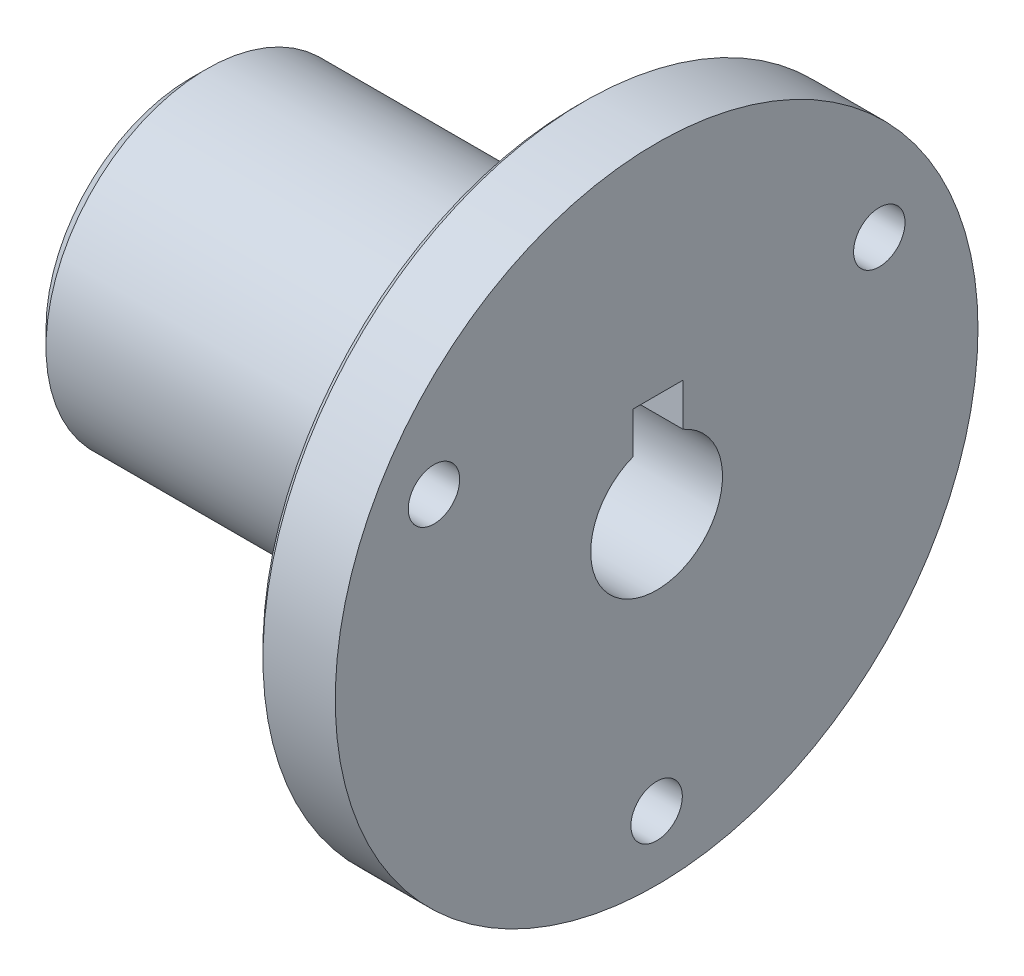
ISO-10303-21;
HEADER;
FILE_DESCRIPTION(('STEP AP214'),'2;1');
FILE_NAME('part.step','',(''),(''),'','','');
FILE_SCHEMA(('AUTOMOTIVE_DESIGN { 1 0 10303 214 1 1 1 1 }'));
ENDSEC;
DATA;
#1=APPLICATION_CONTEXT('core data for automotive mechanical design processes');
#2=APPLICATION_PROTOCOL_DEFINITION('international standard','automotive_design',2000,#1);
#3=PRODUCT_CONTEXT('',#1,'mechanical');
#4=PRODUCT('Part','Part','',(#3));
#5=PRODUCT_RELATED_PRODUCT_CATEGORY('part','',(#4));
#6=PRODUCT_DEFINITION_FORMATION('','',#4);
#7=PRODUCT_DEFINITION_CONTEXT('part definition',#1,'design');
#8=PRODUCT_DEFINITION('design','',#6,#7);
#9=PRODUCT_DEFINITION_SHAPE('','',#8);
#10=(LENGTH_UNIT() NAMED_UNIT(*) SI_UNIT(.MILLI.,.METRE.));
#11=(NAMED_UNIT(*) PLANE_ANGLE_UNIT() SI_UNIT($,.RADIAN.));
#12=(NAMED_UNIT(*) SI_UNIT($,.STERADIAN.) SOLID_ANGLE_UNIT());
#13=UNCERTAINTY_MEASURE_WITH_UNIT(LENGTH_MEASURE(1.E-05),#10,'distance_accuracy_value','');
#14=(GEOMETRIC_REPRESENTATION_CONTEXT(3) GLOBAL_UNCERTAINTY_ASSIGNED_CONTEXT((#13)) GLOBAL_UNIT_ASSIGNED_CONTEXT((#10,
#11,#12)) REPRESENTATION_CONTEXT('',''));
#15=CARTESIAN_POINT('',(0.,0.,0.));
#16=DIRECTION('',(0.,0.,1.));
#17=DIRECTION('',(1.,0.,0.));
#18=AXIS2_PLACEMENT_3D('',#15,#16,#17);
#19=CARTESIAN_POINT('',(0.,0.,0.));
#20=DIRECTION('',(1.,0.,0.));
#21=DIRECTION('',(0.,0.,-1.));
#22=AXIS2_PLACEMENT_3D('',#19,#20,#21);
#23=PLANE('',#22);
#24=CARTESIAN_POINT('',(0.,0.,0.));
#25=DIRECTION('',(1.,0.,0.));
#26=DIRECTION('',(0.,0.,-1.));
#27=AXIS2_PLACEMENT_3D('',#24,#25,#26);
#28=CIRCLE('',#27,9.);
#29=CARTESIAN_POINT('',(0.,0.,-9.));
#30=VERTEX_POINT('',#29);
#31=EDGE_CURVE('E304',#30,#30,#28,.F.);
#32=ORIENTED_EDGE('',*,*,#31,.T.);
#33=EDGE_LOOP('',(#32));
#34=FACE_BOUND('',#33,.T.);
#35=DIRECTION('',(0.,-1.,0.));
#36=VECTOR('',#35,1.);
#37=CARTESIAN_POINT('',(0.,6.00881172752133,1.46));
#38=LINE('',#37,#36);
#39=CARTESIAN_POINT('',(0.,6.4,1.46));
#40=VERTEX_POINT('',#39);
#41=CARTESIAN_POINT('',(0.,4.36215543051827,1.46));
#42=VERTEX_POINT('',#41);
#43=EDGE_CURVE('E142',#40,#42,#38,.T.);
#44=ORIENTED_EDGE('',*,*,#43,.T.);
#45=CARTESIAN_POINT('',(0.,0.,0.));
#46=DIRECTION('',(1.,0.,0.));
#47=DIRECTION('',(0.,0.,-1.));
#48=AXIS2_PLACEMENT_3D('',#45,#46,#47);
#49=CIRCLE('',#48,4.6);
#50=CARTESIAN_POINT('',(0.,4.29772032594025,-1.64));
#51=VERTEX_POINT('',#50);
#52=EDGE_CURVE('E95',#42,#51,#49,.T.);
#53=ORIENTED_EDGE('',*,*,#52,.T.);
#54=DIRECTION('',(0.,1.,0.));
#55=VECTOR('',#54,1.);
#56=CARTESIAN_POINT('',(0.,6.4,-1.64));
#57=LINE('',#56,#55);
#58=CARTESIAN_POINT('',(0.,6.4,-1.64));
#59=VERTEX_POINT('',#58);
#60=EDGE_CURVE('E137',#51,#59,#57,.T.);
#61=ORIENTED_EDGE('',*,*,#60,.T.);
#62=DIRECTION('',(0.,0.,1.));
#63=VECTOR('',#62,1.);
#64=CARTESIAN_POINT('',(0.,6.4,1.46));
#65=LINE('',#64,#63);
#66=EDGE_CURVE('E139',#59,#40,#65,.T.);
#67=ORIENTED_EDGE('',*,*,#66,.T.);
#68=EDGE_LOOP('',(#44,#53,#61,#67));
#69=FACE_BOUND('',#68,.T.);
#70=ADVANCED_FACE('F41',(#34,#69),#23,.F.);
#71=CARTESIAN_POINT('',(24.,0.,0.));
#72=DIRECTION('',(-1.,0.,0.));
#73=DIRECTION('',(0.,0.,1.));
#74=AXIS2_PLACEMENT_3D('',#71,#72,#73);
#75=CYLINDRICAL_SURFACE('',#74,10.);
#76=CARTESIAN_POINT('',(22.,0.,0.));
#77=DIRECTION('',(1.,0.,0.));
#78=DIRECTION('',(0.,0.,-1.));
#79=AXIS2_PLACEMENT_3D('',#76,#77,#78);
#80=CIRCLE('',#79,10.);
#81=CARTESIAN_POINT('',(22.,0.,-10.));
#82=VERTEX_POINT('',#81);
#83=EDGE_CURVE('E11',#82,#82,#80,.F.);
#84=ORIENTED_EDGE('',*,*,#83,.T.);
#85=EDGE_LOOP('',(#84));
#86=FACE_BOUND('',#85,.T.);
#87=CARTESIAN_POINT('',(0.999999999999994,0.,0.));
#88=DIRECTION('',(1.,0.,0.));
#89=DIRECTION('',(0.,0.,-1.));
#90=AXIS2_PLACEMENT_3D('',#87,#88,#89);
#91=CIRCLE('',#90,10.);
#92=CARTESIAN_POINT('',(0.999999999999994,0.,-10.));
#93=VERTEX_POINT('',#92);
#94=EDGE_CURVE('E186',#93,#93,#91,.T.);
#95=ORIENTED_EDGE('',*,*,#94,.T.);
#96=EDGE_LOOP('',(#95));
#97=FACE_BOUND('',#96,.T.);
#98=ADVANCED_FACE('F176',(#86,#97),#75,.T.);
#99=CARTESIAN_POINT('',(24.,0.,0.));
#100=DIRECTION('',(-1.,0.,0.));
#101=DIRECTION('',(0.,0.,1.));
#102=AXIS2_PLACEMENT_3D('',#99,#100,#101);
#103=CYLINDRICAL_SURFACE('',#102,4.1);
#104=DIRECTION('',(-1.,0.,0.));
#105=VECTOR('',#104,1.);
#106=CARTESIAN_POINT('',(24.,3.75771206986379,-1.64));
#107=LINE('',#106,#105);
#108=CARTESIAN_POINT('',(29.,3.75771206986379,-1.64));
#109=VERTEX_POINT('',#108);
#110=CARTESIAN_POINT('',(0.5,3.75771206986379,-1.64));
#111=VERTEX_POINT('',#110);
#112=EDGE_CURVE('E96',#109,#111,#107,.T.);
#113=ORIENTED_EDGE('',*,*,#112,.T.);
#114=CARTESIAN_POINT('',(0.5,0.,0.));
#115=DIRECTION('',(1.,0.,0.));
#116=DIRECTION('',(0.,0.,-1.));
#117=AXIS2_PLACEMENT_3D('',#114,#115,#116);
#118=CIRCLE('',#117,4.1);
#119=CARTESIAN_POINT('',(0.5,3.83124000814358,1.46));
#120=VERTEX_POINT('',#119);
#121=EDGE_CURVE('E57',#111,#120,#118,.F.);
#122=ORIENTED_EDGE('',*,*,#121,.T.);
#123=DIRECTION('',(-1.,0.,0.));
#124=VECTOR('',#123,1.);
#125=CARTESIAN_POINT('',(24.,3.83124000814358,1.46));
#126=LINE('',#125,#124);
#127=CARTESIAN_POINT('',(29.,3.83124000814358,1.46));
#128=VERTEX_POINT('',#127);
#129=EDGE_CURVE('E87',#128,#120,#126,.T.);
#130=ORIENTED_EDGE('',*,*,#129,.F.);
#131=CARTESIAN_POINT('',(29.,0.,0.));
#132=DIRECTION('',(1.,0.,0.));
#133=DIRECTION('',(0.,0.,-1.));
#134=AXIS2_PLACEMENT_3D('',#131,#132,#133);
#135=CIRCLE('',#134,4.1);
#136=EDGE_CURVE('E91',#128,#109,#135,.T.);
#137=ORIENTED_EDGE('',*,*,#136,.T.);
#138=EDGE_LOOP('',(#113,#122,#130,#137));
#139=FACE_BOUND('',#138,.T.);
#140=ADVANCED_FACE('F89',(#139),#103,.F.);
#141=CARTESIAN_POINT('',(24.,6.4,-1.64));
#142=DIRECTION('',(0.,0.,1.));
#143=DIRECTION('',(1.,0.,0.));
#144=AXIS2_PLACEMENT_3D('',#141,#142,#143);
#145=PLANE('',#144);
#146=ORIENTED_EDGE('',*,*,#60,.F.);
#147=CARTESIAN_POINT('',(0.,4.29772032594025,-1.64));
#148=CARTESIAN_POINT('',(0.083734465461264,4.20809163948556,-1.64));
#149=CARTESIAN_POINT('',(0.167296383439877,4.11830132067219,-1.64));
#150=CARTESIAN_POINT('',(0.292317271278129,3.98331792791384,-1.64));
#151=CARTESIAN_POINT('',(0.33393720792005,3.93827384152286,-1.64));
#152=CARTESIAN_POINT('',(0.417059488420711,3.84807683291622,-1.64));
#153=CARTESIAN_POINT('',(0.458561831608511,3.80292391008229,-1.64));
#154=CARTESIAN_POINT('',(0.5,3.75771206986379,-1.64));
#155=B_SPLINE_CURVE_WITH_KNOTS('',3,(#147,#148,#149,#150,#151,#152,#153,#154),.UNSPECIFIED.,.F.,
.F.,(4,2,2,4),(0.,0.36797134451166,0.551956770182269,0.735943243493419),.UNSPECIFIED.);
#156=EDGE_CURVE('E65',#51,#111,#155,.T.);
#157=ORIENTED_EDGE('',*,*,#156,.T.);
#158=ORIENTED_EDGE('',*,*,#112,.F.);
#159=DIRECTION('',(0.,1.,0.));
#160=VECTOR('',#159,1.);
#161=CARTESIAN_POINT('',(29.,6.4,-1.64));
#162=LINE('',#161,#160);
#163=CARTESIAN_POINT('',(29.,6.4,-1.64));
#164=VERTEX_POINT('',#163);
#165=EDGE_CURVE('E111',#109,#164,#162,.T.);
#166=ORIENTED_EDGE('',*,*,#165,.T.);
#167=DIRECTION('',(-1.,0.,0.));
#168=VECTOR('',#167,1.);
#169=CARTESIAN_POINT('',(24.,6.4,-1.64));
#170=LINE('',#169,#168);
#171=EDGE_CURVE('E146',#164,#59,#170,.T.);
#172=ORIENTED_EDGE('',*,*,#171,.T.);
#173=EDGE_LOOP('',(#146,#157,#158,#166,#172));
#174=FACE_BOUND('',#173,.T.);
#175=ADVANCED_FACE('F160',(#174),#145,.T.);
#176=CARTESIAN_POINT('',(24.,6.4,1.46));
#177=DIRECTION('',(0.,-1.,0.));
#178=DIRECTION('',(0.,0.,-1.));
#179=AXIS2_PLACEMENT_3D('',#176,#177,#178);
#180=PLANE('',#179);
#181=ORIENTED_EDGE('',*,*,#66,.F.);
#182=ORIENTED_EDGE('',*,*,#171,.F.);
#183=DIRECTION('',(0.,0.,1.));
#184=VECTOR('',#183,1.);
#185=CARTESIAN_POINT('',(29.,6.4,1.46));
#186=LINE('',#185,#184);
#187=CARTESIAN_POINT('',(29.,6.4,1.46));
#188=VERTEX_POINT('',#187);
#189=EDGE_CURVE('E106',#164,#188,#186,.T.);
#190=ORIENTED_EDGE('',*,*,#189,.T.);
#191=DIRECTION('',(-1.,0.,0.));
#192=VECTOR('',#191,1.);
#193=CARTESIAN_POINT('',(24.,6.4,1.46));
#194=LINE('',#193,#192);
#195=EDGE_CURVE('E102',#188,#40,#194,.T.);
#196=ORIENTED_EDGE('',*,*,#195,.T.);
#197=EDGE_LOOP('',(#181,#182,#190,#196));
#198=FACE_BOUND('',#197,.T.);
#199=ADVANCED_FACE('F192',(#198),#180,.T.);
#200=CARTESIAN_POINT('',(24.,6.00881172752133,1.46));
#201=DIRECTION('',(0.,0.,-1.));
#202=DIRECTION('',(-1.,0.,0.));
#203=AXIS2_PLACEMENT_3D('',#200,#201,#202);
#204=PLANE('',#203);
#205=ORIENTED_EDGE('',*,*,#129,.T.);
#206=CARTESIAN_POINT('',(0.5,3.83124000814358,1.46));
#207=CARTESIAN_POINT('',(0.416990224540825,3.92003066092522,1.46));
#208=CARTESIAN_POINT('',(0.33381866210649,4.00866894765339,1.46));
#209=CARTESIAN_POINT('',(0.167151995315462,4.18564075499451,1.46));
#210=CARTESIAN_POINT('',(0.0836568910831308,4.27397427572456,1.46));
#211=CARTESIAN_POINT('',(0.,4.36215543051827,1.46));
#212=B_SPLINE_CURVE_WITH_KNOTS('',3,(#206,#207,#208,#209,#210,#211),.UNSPECIFIED.,.F.,.F.,(4,2,
4),(0.,0.364648175707579,0.729296211267927),.UNSPECIFIED.);
#213=EDGE_CURVE('E179',#120,#42,#212,.T.);
#214=ORIENTED_EDGE('',*,*,#213,.T.);
#215=ORIENTED_EDGE('',*,*,#43,.F.);
#216=ORIENTED_EDGE('',*,*,#195,.F.);
#217=DIRECTION('',(0.,-1.,0.));
#218=VECTOR('',#217,1.);
#219=CARTESIAN_POINT('',(29.,6.4,1.46));
#220=LINE('',#219,#218);
#221=EDGE_CURVE('E99',#188,#128,#220,.T.);
#222=ORIENTED_EDGE('',*,*,#221,.T.);
#223=EDGE_LOOP('',(#205,#214,#215,#216,#222));
#224=FACE_BOUND('',#223,.T.);
#225=ADVANCED_FACE('F100',(#224),#204,.T.);
#226=CARTESIAN_POINT('',(24.,0.,0.));
#227=DIRECTION('',(1.,0.,0.));
#228=DIRECTION('',(0.,0.,-1.));
#229=AXIS2_PLACEMENT_3D('',#226,#227,#228);
#230=PLANE('',#229);
#231=CARTESIAN_POINT('',(24.,0.,0.));
#232=DIRECTION('',(1.,0.,0.));
#233=DIRECTION('',(0.,0.,-1.));
#234=AXIS2_PLACEMENT_3D('',#231,#232,#233);
#235=CIRCLE('',#234,12.);
#236=CARTESIAN_POINT('',(24.,0.,-12.));
#237=VERTEX_POINT('',#236);
#238=EDGE_CURVE('E50',#237,#237,#235,.T.);
#239=ORIENTED_EDGE('',*,*,#238,.T.);
#240=EDGE_LOOP('',(#239));
#241=FACE_BOUND('',#240,.T.);
#242=CARTESIAN_POINT('',(24.,0.,0.));
#243=DIRECTION('',(1.,0.,0.));
#244=DIRECTION('',(0.,0.,-1.));
#245=AXIS2_PLACEMENT_3D('',#242,#243,#244);
#246=CIRCLE('',#245,19.5);
#247=CARTESIAN_POINT('',(24.,0.,-19.5));
#248=VERTEX_POINT('',#247);
#249=EDGE_CURVE('E298',#248,#248,#246,.F.);
#250=ORIENTED_EDGE('',*,*,#249,.T.);
#251=EDGE_LOOP('',(#250));
#252=FACE_BOUND('',#251,.T.);
#253=CARTESIAN_POINT('',(24.,-16.,0.));
#254=DIRECTION('',(1.,0.,0.));
#255=DIRECTION('',(0.,0.,-1.));
#256=AXIS2_PLACEMENT_3D('',#253,#254,#255);
#257=CIRCLE('',#256,1.6);
#258=CARTESIAN_POINT('',(24.,-16.,-1.6));
#259=VERTEX_POINT('',#258);
#260=EDGE_CURVE('E113',#259,#259,#257,.T.);
#261=ORIENTED_EDGE('',*,*,#260,.T.);
#262=EDGE_LOOP('',(#261));
#263=FACE_BOUND('',#262,.T.);
#264=CARTESIAN_POINT('',(24.,8.,-13.856406460551));
#265=DIRECTION('',(1.,0.,0.));
#266=DIRECTION('',(0.,0.,-1.));
#267=AXIS2_PLACEMENT_3D('',#264,#265,#266);
#268=CIRCLE('',#267,1.6);
#269=CARTESIAN_POINT('',(24.,8.,-15.456406460551));
#270=VERTEX_POINT('',#269);
#271=EDGE_CURVE('E120',#270,#270,#268,.T.);
#272=ORIENTED_EDGE('',*,*,#271,.T.);
#273=EDGE_LOOP('',(#272));
#274=FACE_BOUND('',#273,.T.);
#275=CARTESIAN_POINT('',(24.,7.99999999999991,13.8564064605511));
#276=DIRECTION('',(1.,0.,0.));
#277=DIRECTION('',(0.,0.,-1.));
#278=AXIS2_PLACEMENT_3D('',#275,#276,#277);
#279=CIRCLE('',#278,1.6);
#280=CARTESIAN_POINT('',(24.,7.99999999999991,12.2564064605511));
#281=VERTEX_POINT('',#280);
#282=EDGE_CURVE('E126',#281,#281,#279,.T.);
#283=ORIENTED_EDGE('',*,*,#282,.T.);
#284=EDGE_LOOP('',(#283));
#285=FACE_BOUND('',#284,.T.);
#286=ADVANCED_FACE('F191',(#241,#252,#263,#274,#285),#230,.F.);
#287=CARTESIAN_POINT('',(29.,0.,0.));
#288=DIRECTION('',(1.,0.,0.));
#289=DIRECTION('',(0.,0.,-1.));
#290=AXIS2_PLACEMENT_3D('',#287,#288,#289);
#291=PLANE('',#290);
#292=ORIENTED_EDGE('',*,*,#189,.F.);
#293=ORIENTED_EDGE('',*,*,#165,.F.);
#294=ORIENTED_EDGE('',*,*,#136,.F.);
#295=ORIENTED_EDGE('',*,*,#221,.F.);
#296=EDGE_LOOP('',(#292,#293,#294,#295));
#297=FACE_BOUND('',#296,.T.);
#298=CARTESIAN_POINT('',(29.,8.,-13.856406460551));
#299=DIRECTION('',(1.,0.,0.));
#300=DIRECTION('',(0.,0.,-1.));
#301=AXIS2_PLACEMENT_3D('',#298,#299,#300);
#302=CIRCLE('',#301,1.6);
#303=CARTESIAN_POINT('',(29.,8.,-15.456406460551));
#304=VERTEX_POINT('',#303);
#305=EDGE_CURVE('E123',#304,#304,#302,.T.);
#306=ORIENTED_EDGE('',*,*,#305,.F.);
#307=EDGE_LOOP('',(#306));
#308=FACE_BOUND('',#307,.T.);
#309=CARTESIAN_POINT('',(29.,0.,0.));
#310=DIRECTION('',(1.,0.,0.));
#311=DIRECTION('',(0.,0.,-1.));
#312=AXIS2_PLACEMENT_3D('',#309,#310,#311);
#313=CIRCLE('',#312,20.);
#314=CARTESIAN_POINT('',(29.,0.,-20.));
#315=VERTEX_POINT('',#314);
#316=EDGE_CURVE('E132',#315,#315,#313,.T.);
#317=ORIENTED_EDGE('',*,*,#316,.T.);
#318=EDGE_LOOP('',(#317));
#319=FACE_BOUND('',#318,.T.);
#320=CARTESIAN_POINT('',(29.,7.99999999999991,13.8564064605511));
#321=DIRECTION('',(1.,0.,0.));
#322=DIRECTION('',(0.,0.,-1.));
#323=AXIS2_PLACEMENT_3D('',#320,#321,#322);
#324=CIRCLE('',#323,1.6);
#325=CARTESIAN_POINT('',(29.,7.99999999999991,12.2564064605511));
#326=VERTEX_POINT('',#325);
#327=EDGE_CURVE('E129',#326,#326,#324,.T.);
#328=ORIENTED_EDGE('',*,*,#327,.F.);
#329=EDGE_LOOP('',(#328));
#330=FACE_BOUND('',#329,.T.);
#331=CARTESIAN_POINT('',(29.,-16.,0.));
#332=DIRECTION('',(1.,0.,0.));
#333=DIRECTION('',(0.,0.,-1.));
#334=AXIS2_PLACEMENT_3D('',#331,#332,#333);
#335=CIRCLE('',#334,1.6);
#336=CARTESIAN_POINT('',(29.,-16.,-1.6));
#337=VERTEX_POINT('',#336);
#338=EDGE_CURVE('E117',#337,#337,#335,.T.);
#339=ORIENTED_EDGE('',*,*,#338,.F.);
#340=EDGE_LOOP('',(#339));
#341=FACE_BOUND('',#340,.T.);
#342=ADVANCED_FACE('F108',(#297,#308,#319,#330,#341),#291,.T.);
#343=CARTESIAN_POINT('',(29.,0.,0.));
#344=DIRECTION('',(-1.,0.,0.));
#345=DIRECTION('',(0.,0.,1.));
#346=AXIS2_PLACEMENT_3D('',#343,#344,#345);
#347=CYLINDRICAL_SURFACE('',#346,20.);
#348=CARTESIAN_POINT('',(24.5,0.,0.));
#349=DIRECTION('',(1.,0.,0.));
#350=DIRECTION('',(0.,0.,-1.));
#351=AXIS2_PLACEMENT_3D('',#348,#349,#350);
#352=CIRCLE('',#351,20.);
#353=CARTESIAN_POINT('',(24.5,0.,-20.));
#354=VERTEX_POINT('',#353);
#355=EDGE_CURVE('E300',#354,#354,#352,.T.);
#356=ORIENTED_EDGE('',*,*,#355,.T.);
#357=EDGE_LOOP('',(#356));
#358=FACE_BOUND('',#357,.T.);
#359=ORIENTED_EDGE('',*,*,#316,.F.);
#360=EDGE_LOOP('',(#359));
#361=FACE_BOUND('',#360,.T.);
#362=ADVANCED_FACE('F193',(#358,#361),#347,.T.);
#363=CARTESIAN_POINT('',(29.,7.99999999999991,13.8564064605511));
#364=DIRECTION('',(-1.,0.,0.));
#365=DIRECTION('',(0.,0.,1.));
#366=AXIS2_PLACEMENT_3D('',#363,#364,#365);
#367=CYLINDRICAL_SURFACE('',#366,1.6);
#368=ORIENTED_EDGE('',*,*,#327,.T.);
#369=EDGE_LOOP('',(#368));
#370=FACE_BOUND('',#369,.T.);
#371=ORIENTED_EDGE('',*,*,#282,.F.);
#372=EDGE_LOOP('',(#371));
#373=FACE_BOUND('',#372,.T.);
#374=ADVANCED_FACE('F261',(#370,#373),#367,.F.);
#375=CARTESIAN_POINT('',(29.,8.,-13.856406460551));
#376=DIRECTION('',(-1.,0.,0.));
#377=DIRECTION('',(0.,0.,1.));
#378=AXIS2_PLACEMENT_3D('',#375,#376,#377);
#379=CYLINDRICAL_SURFACE('',#378,1.6);
#380=ORIENTED_EDGE('',*,*,#305,.T.);
#381=EDGE_LOOP('',(#380));
#382=FACE_BOUND('',#381,.T.);
#383=ORIENTED_EDGE('',*,*,#271,.F.);
#384=EDGE_LOOP('',(#383));
#385=FACE_BOUND('',#384,.T.);
#386=ADVANCED_FACE('F322',(#382,#385),#379,.F.);
#387=CARTESIAN_POINT('',(29.,-16.,0.));
#388=DIRECTION('',(-1.,0.,0.));
#389=DIRECTION('',(0.,0.,1.));
#390=AXIS2_PLACEMENT_3D('',#387,#388,#389);
#391=CYLINDRICAL_SURFACE('',#390,1.6);
#392=ORIENTED_EDGE('',*,*,#338,.T.);
#393=EDGE_LOOP('',(#392));
#394=FACE_BOUND('',#393,.T.);
#395=ORIENTED_EDGE('',*,*,#260,.F.);
#396=EDGE_LOOP('',(#395));
#397=FACE_BOUND('',#396,.T.);
#398=ADVANCED_FACE('F174',(#394,#397),#391,.F.);
#399=CARTESIAN_POINT('',(0.,0.,0.));
#400=DIRECTION('',(-1.,0.,0.));
#401=DIRECTION('',(0.,0.,1.));
#402=AXIS2_PLACEMENT_3D('',#399,#400,#401);
#403=CONICAL_SURFACE('',#402,4.6,0.785398163397448);
#404=ORIENTED_EDGE('',*,*,#213,.F.);
#405=ORIENTED_EDGE('',*,*,#121,.F.);
#406=ORIENTED_EDGE('',*,*,#156,.F.);
#407=ORIENTED_EDGE('',*,*,#52,.F.);
#408=EDGE_LOOP('',(#404,#405,#406,#407));
#409=FACE_BOUND('',#408,.T.);
#410=ADVANCED_FACE('F165',(#409),#403,.F.);
#411=CARTESIAN_POINT('',(0.999999999999994,0.,0.));
#412=DIRECTION('',(1.,0.,0.));
#413=DIRECTION('',(0.,0.,-1.));
#414=AXIS2_PLACEMENT_3D('',#411,#412,#413);
#415=CONICAL_SURFACE('',#414,10.,0.785398163397451);
#416=ORIENTED_EDGE('',*,*,#31,.F.);
#417=EDGE_LOOP('',(#416));
#418=FACE_BOUND('',#417,.T.);
#419=ORIENTED_EDGE('',*,*,#94,.F.);
#420=EDGE_LOOP('',(#419));
#421=FACE_BOUND('',#420,.T.);
#422=ADVANCED_FACE('F173',(#418,#421),#415,.T.);
#423=CARTESIAN_POINT('',(24.5,0.,0.));
#424=DIRECTION('',(1.,0.,0.));
#425=DIRECTION('',(0.,0.,-1.));
#426=AXIS2_PLACEMENT_3D('',#423,#424,#425);
#427=CONICAL_SURFACE('',#426,20.,0.785398163397455);
#428=ORIENTED_EDGE('',*,*,#249,.F.);
#429=EDGE_LOOP('',(#428));
#430=FACE_BOUND('',#429,.T.);
#431=ORIENTED_EDGE('',*,*,#355,.F.);
#432=EDGE_LOOP('',(#431));
#433=FACE_BOUND('',#432,.T.);
#434=ADVANCED_FACE('F250',(#430,#433),#427,.T.);
#435=CARTESIAN_POINT('',(24.,0.,0.));
#436=DIRECTION('',(1.,0.,0.));
#437=DIRECTION('',(0.,0.,-1.));
#438=AXIS2_PLACEMENT_3D('',#435,#436,#437);
#439=CONICAL_SURFACE('',#438,12.,0.785398163397454);
#440=ORIENTED_EDGE('',*,*,#83,.F.);
#441=EDGE_LOOP('',(#440));
#442=FACE_BOUND('',#441,.T.);
#443=ORIENTED_EDGE('',*,*,#238,.F.);
#444=EDGE_LOOP('',(#443));
#445=FACE_BOUND('',#444,.T.);
#446=ADVANCED_FACE('F44',(#442,#445),#439,.T.);
#447=CLOSED_SHELL('',(#70,#98,#140,#175,#199,#225,#286,#342,#362,#374,#386,#398,#410,#422,#434,#446));
#448=MANIFOLD_SOLID_BREP('B2',#447);
#449=ADVANCED_BREP_SHAPE_REPRESENTATION('',(#18,#448),#14);
#450=SHAPE_DEFINITION_REPRESENTATION(#9,#449);
ENDSEC;
END-ISO-10303-21;
